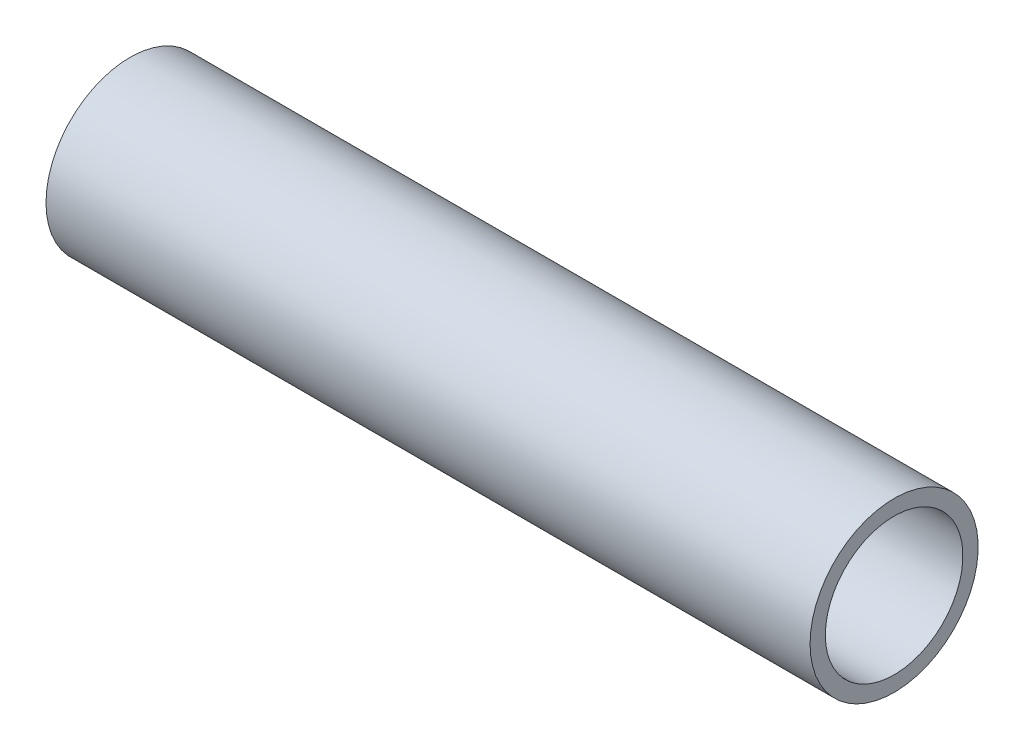
ISO-10303-21;
HEADER;
FILE_DESCRIPTION(('STEP AP214'),'2;1');
FILE_NAME('part.step','',(''),(''),'','','');
FILE_SCHEMA(('AUTOMOTIVE_DESIGN { 1 0 10303 214 1 1 1 1 }'));
ENDSEC;
DATA;
#1=APPLICATION_CONTEXT('core data for automotive mechanical design processes');
#2=APPLICATION_PROTOCOL_DEFINITION('international standard','automotive_design',2000,#1);
#3=PRODUCT_CONTEXT('',#1,'mechanical');
#4=PRODUCT('Part','Part','',(#3));
#5=PRODUCT_RELATED_PRODUCT_CATEGORY('part','',(#4));
#6=PRODUCT_DEFINITION_FORMATION('','',#4);
#7=PRODUCT_DEFINITION_CONTEXT('part definition',#1,'design');
#8=PRODUCT_DEFINITION('design','',#6,#7);
#9=PRODUCT_DEFINITION_SHAPE('','',#8);
#10=(LENGTH_UNIT() NAMED_UNIT(*) SI_UNIT(.MILLI.,.METRE.));
#11=(NAMED_UNIT(*) PLANE_ANGLE_UNIT() SI_UNIT($,.RADIAN.));
#12=(NAMED_UNIT(*) SI_UNIT($,.STERADIAN.) SOLID_ANGLE_UNIT());
#13=UNCERTAINTY_MEASURE_WITH_UNIT(LENGTH_MEASURE(1.E-05),#10,'distance_accuracy_value','');
#14=(GEOMETRIC_REPRESENTATION_CONTEXT(3) GLOBAL_UNCERTAINTY_ASSIGNED_CONTEXT((#13)) GLOBAL_UNIT_ASSIGNED_CONTEXT((#10,
#11,#12)) REPRESENTATION_CONTEXT('',''));
#15=CARTESIAN_POINT('',(0.,0.,0.));
#16=DIRECTION('',(0.,0.,1.));
#17=DIRECTION('',(1.,0.,0.));
#18=AXIS2_PLACEMENT_3D('',#15,#16,#17);
#19=CARTESIAN_POINT('',(-250.,0.,0.));
#20=DIRECTION('',(-1.,0.,0.));
#21=DIRECTION('',(0.,0.,1.));
#22=AXIS2_PLACEMENT_3D('',#19,#20,#21);
#23=PLANE('',#22);
#24=CARTESIAN_POINT('',(-250.,0.,22.5));
#25=DIRECTION('',(-1.,0.,0.));
#26=DIRECTION('',(0.,0.,1.));
#27=AXIS2_PLACEMENT_3D('',#24,#25,#26);
#28=CIRCLE('',#27,27.5);
#29=CARTESIAN_POINT('',(-250.,0.,50.));
#30=VERTEX_POINT('',#29);
#31=EDGE_CURVE('E52',#30,#30,#28,.T.);
#32=ORIENTED_EDGE('',*,*,#31,.T.);
#33=EDGE_LOOP('',(#32));
#34=FACE_BOUND('',#33,.T.);
#35=CARTESIAN_POINT('',(-250.,0.,22.5));
#36=DIRECTION('',(-1.,0.,0.));
#37=DIRECTION('',(0.,0.,1.));
#38=AXIS2_PLACEMENT_3D('',#35,#36,#37);
#39=CIRCLE('',#38,22.5);
#40=CARTESIAN_POINT('',(-250.,0.,45.0000000000001));
#41=VERTEX_POINT('',#40);
#42=EDGE_CURVE('E10',#41,#41,#39,.T.);
#43=ORIENTED_EDGE('',*,*,#42,.F.);
#44=EDGE_LOOP('',(#43));
#45=FACE_BOUND('',#44,.T.);
#46=ADVANCED_FACE('F39',(#34,#45),#23,.T.);
#47=CARTESIAN_POINT('',(-250.,0.,22.5));
#48=DIRECTION('',(-1.,0.,0.));
#49=DIRECTION('',(0.,0.,1.));
#50=AXIS2_PLACEMENT_3D('',#47,#48,#49);
#51=CYLINDRICAL_SURFACE('',#50,22.5);
#52=ORIENTED_EDGE('',*,*,#42,.T.);
#53=EDGE_LOOP('',(#52));
#54=FACE_BOUND('',#53,.T.);
#55=CARTESIAN_POINT('',(0.,0.,22.5));
#56=DIRECTION('',(-1.,0.,0.));
#57=DIRECTION('',(0.,0.,1.));
#58=AXIS2_PLACEMENT_3D('',#55,#56,#57);
#59=CIRCLE('',#58,22.5);
#60=CARTESIAN_POINT('',(0.,0.,45.0000000000001));
#61=VERTEX_POINT('',#60);
#62=EDGE_CURVE('E44',#61,#61,#59,.T.);
#63=ORIENTED_EDGE('',*,*,#62,.F.);
#64=EDGE_LOOP('',(#63));
#65=FACE_BOUND('',#64,.T.);
#66=ADVANCED_FACE('F68',(#54,#65),#51,.F.);
#67=CARTESIAN_POINT('',(0.,0.,0.));
#68=DIRECTION('',(-1.,0.,0.));
#69=DIRECTION('',(0.,0.,1.));
#70=AXIS2_PLACEMENT_3D('',#67,#68,#69);
#71=PLANE('',#70);
#72=CARTESIAN_POINT('',(0.,0.,22.5));
#73=DIRECTION('',(-1.,0.,0.));
#74=DIRECTION('',(0.,0.,1.));
#75=AXIS2_PLACEMENT_3D('',#72,#73,#74);
#76=CIRCLE('',#75,27.5);
#77=CARTESIAN_POINT('',(0.,0.,50.0000000000001));
#78=VERTEX_POINT('',#77);
#79=EDGE_CURVE('E47',#78,#78,#76,.T.);
#80=ORIENTED_EDGE('',*,*,#79,.F.);
#81=EDGE_LOOP('',(#80));
#82=FACE_BOUND('',#81,.T.);
#83=ORIENTED_EDGE('',*,*,#62,.T.);
#84=EDGE_LOOP('',(#83));
#85=FACE_BOUND('',#84,.T.);
#86=ADVANCED_FACE('F63',(#82,#85),#71,.F.);
#87=CARTESIAN_POINT('',(-250.,0.,22.5));
#88=DIRECTION('',(-1.,0.,0.));
#89=DIRECTION('',(0.,0.,1.));
#90=AXIS2_PLACEMENT_3D('',#87,#88,#89);
#91=CYLINDRICAL_SURFACE('',#90,27.5);
#92=ORIENTED_EDGE('',*,*,#31,.F.);
#93=EDGE_LOOP('',(#92));
#94=FACE_BOUND('',#93,.T.);
#95=ORIENTED_EDGE('',*,*,#79,.T.);
#96=EDGE_LOOP('',(#95));
#97=FACE_BOUND('',#96,.T.);
#98=ADVANCED_FACE('F64',(#94,#97),#91,.T.);
#99=CLOSED_SHELL('',(#46,#66,#86,#98));
#100=MANIFOLD_SOLID_BREP('B2',#99);
#101=ADVANCED_BREP_SHAPE_REPRESENTATION('',(#18,#100),#14);
#102=SHAPE_DEFINITION_REPRESENTATION(#9,#101);
ENDSEC;
END-ISO-10303-21;
